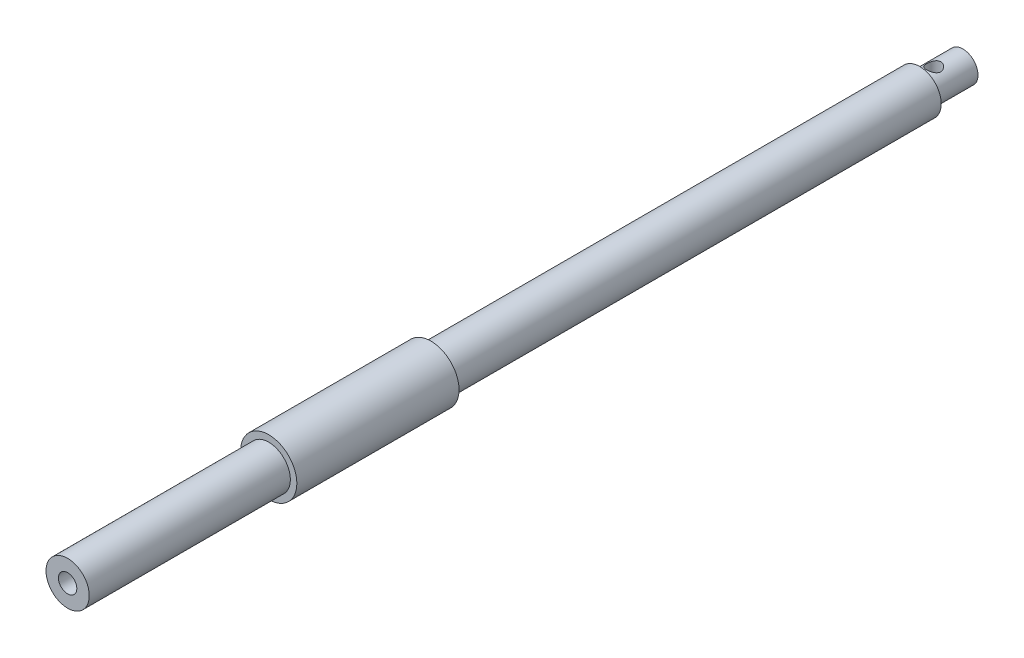
ISO-10303-21;
HEADER;
FILE_DESCRIPTION(('STEP AP214'),'2;1');
FILE_NAME('part.step','',(''),(''),'','','');
FILE_SCHEMA(('AUTOMOTIVE_DESIGN { 1 0 10303 214 1 1 1 1 }'));
ENDSEC;
DATA;
#1=APPLICATION_CONTEXT('core data for automotive mechanical design processes');
#2=APPLICATION_PROTOCOL_DEFINITION('international standard','automotive_design',2000,#1);
#3=PRODUCT_CONTEXT('',#1,'mechanical');
#4=PRODUCT('Part','Part','',(#3));
#5=PRODUCT_RELATED_PRODUCT_CATEGORY('part','',(#4));
#6=PRODUCT_DEFINITION_FORMATION('','',#4);
#7=PRODUCT_DEFINITION_CONTEXT('part definition',#1,'design');
#8=PRODUCT_DEFINITION('design','',#6,#7);
#9=PRODUCT_DEFINITION_SHAPE('','',#8);
#10=(LENGTH_UNIT() NAMED_UNIT(*) SI_UNIT(.MILLI.,.METRE.));
#11=(NAMED_UNIT(*) PLANE_ANGLE_UNIT() SI_UNIT($,.RADIAN.));
#12=(NAMED_UNIT(*) SI_UNIT($,.STERADIAN.) SOLID_ANGLE_UNIT());
#13=UNCERTAINTY_MEASURE_WITH_UNIT(LENGTH_MEASURE(1.E-05),#10,'distance_accuracy_value','');
#14=(GEOMETRIC_REPRESENTATION_CONTEXT(3) GLOBAL_UNCERTAINTY_ASSIGNED_CONTEXT((#13)) GLOBAL_UNIT_ASSIGNED_CONTEXT((#10,
#11,#12)) REPRESENTATION_CONTEXT('',''));
#15=CARTESIAN_POINT('',(0.,0.,0.));
#16=DIRECTION('',(0.,0.,1.));
#17=DIRECTION('',(1.,0.,0.));
#18=AXIS2_PLACEMENT_3D('',#15,#16,#17);
#19=CARTESIAN_POINT('',(0.,0.,20.));
#20=DIRECTION('',(0.,0.,-1.));
#21=DIRECTION('',(-1.,0.,0.));
#22=AXIS2_PLACEMENT_3D('',#19,#20,#21);
#23=CYLINDRICAL_SURFACE('',#22,7.);
#24=CARTESIAN_POINT('',(0.,0.,20.));
#25=DIRECTION('',(0.,0.,1.));
#26=DIRECTION('',(1.,0.,0.));
#27=AXIS2_PLACEMENT_3D('',#24,#25,#26);
#28=CIRCLE('',#27,7.);
#29=CARTESIAN_POINT('',(7.,0.,20.));
#30=VERTEX_POINT('',#29);
#31=EDGE_CURVE('E13',#30,#30,#28,.T.);
#32=ORIENTED_EDGE('',*,*,#31,.F.);
#33=EDGE_LOOP('',(#32));
#34=FACE_BOUND('',#33,.T.);
#35=CARTESIAN_POINT('',(0.,0.,0.));
#36=DIRECTION('',(0.,0.,1.));
#37=DIRECTION('',(1.,0.,0.));
#38=AXIS2_PLACEMENT_3D('',#35,#36,#37);
#39=CIRCLE('',#38,7.);
#40=CARTESIAN_POINT('',(7.,0.,0.));
#41=VERTEX_POINT('',#40);
#42=EDGE_CURVE('E73',#41,#41,#39,.T.);
#43=ORIENTED_EDGE('',*,*,#42,.T.);
#44=EDGE_LOOP('',(#43));
#45=FACE_BOUND('',#44,.T.);
#46=CARTESIAN_POINT('',(0.,-7.,10.25));
#47=CARTESIAN_POINT('',(0.0861856963908761,-6.99999913006246,10.2500011245142));
#48=CARTESIAN_POINT('',(0.172391418701651,-6.99840259768201,10.2534350214332));
#49=CARTESIAN_POINT('',(0.344155703874993,-6.99206483902618,10.2671221716036));
#50=CARTESIAN_POINT('',(0.429713903338527,-6.98732196273839,10.2773790029606));
#51=CARTESIAN_POINT('',(0.684731071048861,-6.96850705576051,10.3182968315066));
#52=CARTESIAN_POINT('',(0.852354462635232,-6.949849085893,10.3591048973368));
#53=CARTESIAN_POINT('',(1.17699843425214,-6.9022888874285,10.4658058978972));
#54=CARTESIAN_POINT('',(1.33405563671226,-6.87342447091548,10.531606308686));
#55=CARTESIAN_POINT('',(1.63474648490266,-6.80817682296697,10.6859881397289));
#56=CARTESIAN_POINT('',(1.77838246178129,-6.77179490079436,10.7745655937461));
#57=CARTESIAN_POINT('',(2.0568928450922,-6.69262946616689,10.9775065695655));
#58=CARTESIAN_POINT('',(2.1908681460804,-6.64960563489607,11.0930090008635));
#59=CARTESIAN_POINT('',(2.43834503289838,-6.56290303614688,11.3440549479489));
#60=CARTESIAN_POINT('',(2.55183328177385,-6.51922386193732,11.4796114150864));
#61=CARTESIAN_POINT('',(2.76244761443808,-6.43293703458588,11.7775904582445));
#62=CARTESIAN_POINT('',(2.85804962354421,-6.39057947032101,11.9411809113943));
#63=CARTESIAN_POINT('',(2.97945647393375,-6.33441607101039,12.1983238207527));
#64=CARTESIAN_POINT('',(3.01626861940464,-6.31691882714229,12.2860311208759));
#65=CARTESIAN_POINT('',(3.0821996296049,-6.28501296988896,12.4648168090702));
#66=CARTESIAN_POINT('',(3.11132276348096,-6.27060264340591,12.5558932943148));
#67=CARTESIAN_POINT('',(3.16013471397663,-6.24613907975203,12.7356429412318));
#68=CARTESIAN_POINT('',(3.18025438632322,-6.23588976465239,12.8241726989511));
#69=CARTESIAN_POINT('',(3.21304328120348,-6.21905884779143,13.0029057615992));
#70=CARTESIAN_POINT('',(3.22571621043937,-6.2124754213774,13.0931082108214));
#71=CARTESIAN_POINT('',(3.24344056616564,-6.20324085261713,13.2744278730185));
#72=CARTESIAN_POINT('',(3.24849524667927,-6.20058803137871,13.3655446786883));
#73=CARTESIAN_POINT('',(3.25092816661809,-6.19931097225763,13.5478799630924));
#74=CARTESIAN_POINT('',(3.2483069741168,-6.20068643625094,13.6390984338032));
#75=CARTESIAN_POINT('',(3.23023537804053,-6.21013911943099,13.8935633316105));
#76=CARTESIAN_POINT('',(3.2062083407774,-6.22269266506459,14.0561306900975));
#77=CARTESIAN_POINT('',(3.13440110634058,-6.2591610358673,14.3744887123914));
#78=CARTESIAN_POINT('',(3.08661489368922,-6.28307873820753,14.5302776491318));
#79=CARTESIAN_POINT('',(2.96772025611693,-6.34011527826854,14.8351059392917));
#80=CARTESIAN_POINT('',(2.8961004781902,-6.37343317440139,14.9839074943189));
#81=CARTESIAN_POINT('',(2.73194278266083,-6.4455031715495,15.2680348611697));
#82=CARTESIAN_POINT('',(2.63939575408318,-6.48425763665393,15.40335476649));
#83=CARTESIAN_POINT('',(2.42439272488121,-6.56787549574391,15.6719796975151));
#84=CARTESIAN_POINT('',(2.29979258534675,-6.61294809248038,15.8035092289553));
#85=CARTESIAN_POINT('',(2.02998577820527,-6.70069225592294,16.0444820385043));
#86=CARTESIAN_POINT('',(1.88477174910972,-6.74336295724555,16.1539173925303));
#87=CARTESIAN_POINT('',(1.57134193363961,-6.8233354701983,16.3511090968648));
#88=CARTESIAN_POINT('',(1.40249994500231,-6.86039773103516,16.437974842921));
#89=CARTESIAN_POINT('',(1.05043674581832,-6.92303804244927,16.581418953379));
#90=CARTESIAN_POINT('',(0.867225528202251,-6.94862399235188,16.6380181558923));
#91=CARTESIAN_POINT('',(0.506307506315073,-6.9838417580902,16.715218057798));
#92=CARTESIAN_POINT('',(0.329210913067729,-6.99452205167419,16.7381908267144));
#93=CARTESIAN_POINT('',(-0.0266202705065465,-7.00220752838156,16.7547621938198));
#94=CARTESIAN_POINT('',(-0.205354207977431,-6.99921794384565,16.7483720310847));
#95=CARTESIAN_POINT('',(-0.547150404219399,-6.98054813741568,16.7079322071247));
#96=CARTESIAN_POINT('',(-0.710478758260401,-6.96570092801084,16.6756975878683));
#97=CARTESIAN_POINT('',(-1.02914713220318,-6.92579653507618,16.587185275798));
#98=CARTESIAN_POINT('',(-1.18448621068133,-6.90073815139346,16.5309047567529));
#99=CARTESIAN_POINT('',(-1.48822015110681,-6.84177485790049,16.3941831645112));
#100=CARTESIAN_POINT('',(-1.63625485581478,-6.80762172693623,16.3130526975882));
#101=CARTESIAN_POINT('',(-1.91713534908754,-6.73392242732704,16.1296872444103));
#102=CARTESIAN_POINT('',(-2.04997442237811,-6.69437389113522,16.0274429830798));
#103=CARTESIAN_POINT('',(-2.30891012896,-6.60977036613832,15.7944172280544));
#104=CARTESIAN_POINT('',(-2.43341327909705,-6.56453572484847,15.6619263668846));
#105=CARTESIAN_POINT('',(-2.65902019159021,-6.4764428206208,15.3775193080519));
#106=CARTESIAN_POINT('',(-2.76011310981348,-6.43358566594895,15.2255941583827));
#107=CARTESIAN_POINT('',(-2.93886459257494,-6.35397329505537,14.9003751997244));
#108=CARTESIAN_POINT('',(-3.01568755228916,-6.31745196246493,14.7265601702027));
#109=CARTESIAN_POINT('',(-3.13819963753806,-6.25751015574103,14.3662065731531));
#110=CARTESIAN_POINT('',(-3.18392278476634,-6.23407537059824,14.1796821557272));
#111=CARTESIAN_POINT('',(-3.23920474553833,-6.20551630670493,13.8171761090029));
#112=CARTESIAN_POINT('',(-3.25163716417708,-6.19893936642936,13.6417475830149));
#113=CARTESIAN_POINT('',(-3.24801791649853,-6.20083820522232,13.2912908949258));
#114=CARTESIAN_POINT('',(-3.23197401367782,-6.20930988158857,13.1162626367254));
#115=CARTESIAN_POINT('',(-3.17443948142412,-6.23889803868127,12.7846401086296));
#116=CARTESIAN_POINT('',(-3.13484904168296,-6.25906774176591,12.6276222948128));
#117=CARTESIAN_POINT('',(-3.03346557194015,-6.30882368123357,12.3225253112951));
#118=CARTESIAN_POINT('',(-2.9716659532672,-6.33841271169734,12.1744488094052));
#119=CARTESIAN_POINT('',(-2.82297889484252,-6.40608082132019,11.8806907000352));
#120=CARTESIAN_POINT('',(-2.73470386642308,-6.44459162233717,11.7358134627078));
#121=CARTESIAN_POINT('',(-2.53726786687814,-6.52484606904618,11.4620405564908));
#122=CARTESIAN_POINT('',(-2.42809724544995,-6.56659120314142,11.333152317377));
#123=CARTESIAN_POINT('',(-2.17927051260506,-6.65355688922769,11.0818240669346));
#124=CARTESIAN_POINT('',(-2.03766698810653,-6.69871272434485,10.9612832549539));
#125=CARTESIAN_POINT('',(-1.73464778273107,-6.78348447111363,10.7453585286674));
#126=CARTESIAN_POINT('',(-1.57322278631313,-6.82309775906699,10.6499865098144));
#127=CARTESIAN_POINT('',(-1.31995138508749,-6.87496622745453,10.5286425369424));
#128=CARTESIAN_POINT('',(-1.23389302872136,-6.89096753480112,10.491876361338));
#129=CARTESIAN_POINT('',(-1.05850829561943,-6.92007501055815,10.4257806539752));
#130=CARTESIAN_POINT('',(-0.969183530687711,-6.93318258499267,10.3964475095829));
#131=CARTESIAN_POINT('',(-0.788152194058379,-6.95608561627893,10.3456158356057));
#132=CARTESIAN_POINT('',(-0.696451696342609,-6.965888765003,10.3240991021722));
#133=CARTESIAN_POINT('',(-0.511269087609372,-6.98192147613309,10.2890855317888));
#134=CARTESIAN_POINT('',(-0.41778820568039,-6.98815341767733,10.2755833553256));
#135=CARTESIAN_POINT('',(-0.2700750880978,-6.99499550057115,10.2607899065486));
#136=CARTESIAN_POINT('',(-0.216160492726661,-6.99687012279065,10.2567458809472));
#137=CARTESIAN_POINT('',(-0.108166562650541,-6.99937265737051,10.2513505491305));
#138=CARTESIAN_POINT('',(-0.0540872248220103,-7.00000054594335,10.2499992942929));
#139=CARTESIAN_POINT('',(0.,-7.,10.25));
#140=B_SPLINE_CURVE_WITH_KNOTS('',3,(#46,#47,#48,#49,#50,#51,#52,#53,#54,#55,#56,#57,#58,#59,
#60,#61,#62,#63,#64,#65,#66,#67,#68,#69,#70,#71,#72,#73,#74,#75,#76,#77,#78,#79,#80,#81,#82,#83,
#84,#85,#86,#87,#88,#89,#90,#91,#92,#93,#94,#95,#96,#97,#98,#99,#100,#101,#102,#103,#104,#105,
#106,#107,#108,#109,#110,#111,#112,#113,#114,#115,#116,#117,#118,#119,#120,#121,#122,#123,#124,
#125,#126,#127,#128,#129,#130,#131,#132,#133,#134,#135,#136,#137,#138,#139),.UNSPECIFIED.,.T.,
.F.,(4,2,2,2,2,2,2,2,2,2,2,2,2,2,2,2,2,2,2,2,2,2,2,2,2,2,2,2,2,2,2,2,2,2,2,2,2,2,2,2,2,2,2,2,2,
2,4),(0.,0.258499355359931,0.517134380784227,1.03493166321568,1.55083040768866,2.06663937788665,
2.61045344917728,3.15462027361182,3.73382572601273,4.02363573287214,4.31328448938218,
4.58699950726073,4.86057816466841,5.13403993381342,5.40748146520002,5.89938587989532,
6.39141490110333,6.89476573823468,7.39833613964655,7.95596105184819,8.51378560248522,
9.09109180761806,9.66800003171593,10.2018381353714,10.7354719219909,11.2346035319441,
11.7337938234051,12.2483263411222,12.7630853704204,13.3226531180825,13.8824795536027,
14.4598862787273,15.0366603284517,15.5617481329868,16.0866928048758,16.5741279978767,
17.0617079150486,17.5814966706898,18.1015260644058,18.6729991713513,19.2447418901874,
19.5292427093132,19.8136049877625,20.0973006960012,20.3808071857779,20.5430295333061,
20.7052549759861),.UNSPECIFIED.);
#141=CARTESIAN_POINT('',(0.,-7.,10.25));
#142=VERTEX_POINT('',#141);
#143=EDGE_CURVE('E111',#142,#142,#140,.T.);
#144=ORIENTED_EDGE('',*,*,#143,.F.);
#145=EDGE_LOOP('',(#144));
#146=FACE_BOUND('',#145,.T.);
#147=CARTESIAN_POINT('',(0.,7.,10.25));
#148=CARTESIAN_POINT('',(-0.0861856963908761,6.99999913006246,10.2500011245142));
#149=CARTESIAN_POINT('',(-0.172391418701651,6.99840259768201,10.2534350214332));
#150=CARTESIAN_POINT('',(-0.344155703874993,6.99206483902618,10.2671221716036));
#151=CARTESIAN_POINT('',(-0.429713903338527,6.98732196273839,10.2773790029606));
#152=CARTESIAN_POINT('',(-0.684731071048861,6.96850705576051,10.3182968315066));
#153=CARTESIAN_POINT('',(-0.852354462635232,6.949849085893,10.3591048973368));
#154=CARTESIAN_POINT('',(-1.17699843425214,6.9022888874285,10.4658058978972));
#155=CARTESIAN_POINT('',(-1.33405563671226,6.87342447091548,10.531606308686));
#156=CARTESIAN_POINT('',(-1.63474648490266,6.80817682296697,10.6859881397289));
#157=CARTESIAN_POINT('',(-1.77838246178129,6.77179490079436,10.7745655937461));
#158=CARTESIAN_POINT('',(-2.0568928450922,6.69262946616689,10.9775065695655));
#159=CARTESIAN_POINT('',(-2.1908681460804,6.64960563489607,11.0930090008635));
#160=CARTESIAN_POINT('',(-2.43834503289838,6.56290303614688,11.3440549479489));
#161=CARTESIAN_POINT('',(-2.55183328177385,6.51922386193732,11.4796114150864));
#162=CARTESIAN_POINT('',(-2.76244761443808,6.43293703458588,11.7775904582445));
#163=CARTESIAN_POINT('',(-2.85804962354421,6.39057947032101,11.9411809113943));
#164=CARTESIAN_POINT('',(-2.97945647393375,6.33441607101039,12.1983238207527));
#165=CARTESIAN_POINT('',(-3.01626861940464,6.31691882714229,12.2860311208759));
#166=CARTESIAN_POINT('',(-3.0821996296049,6.28501296988896,12.4648168090702));
#167=CARTESIAN_POINT('',(-3.11132276348096,6.27060264340591,12.5558932943148));
#168=CARTESIAN_POINT('',(-3.16013471397663,6.24613907975203,12.7356429412318));
#169=CARTESIAN_POINT('',(-3.18025438632322,6.23588976465239,12.8241726989511));
#170=CARTESIAN_POINT('',(-3.21304328120348,6.21905884779143,13.0029057615992));
#171=CARTESIAN_POINT('',(-3.22571621043937,6.2124754213774,13.0931082108214));
#172=CARTESIAN_POINT('',(-3.24344056616564,6.20324085261713,13.2744278730185));
#173=CARTESIAN_POINT('',(-3.24849524667927,6.20058803137871,13.3655446786883));
#174=CARTESIAN_POINT('',(-3.25092816661809,6.19931097225763,13.5478799630924));
#175=CARTESIAN_POINT('',(-3.2483069741168,6.20068643625094,13.6390984338032));
#176=CARTESIAN_POINT('',(-3.23023537804053,6.21013911943099,13.8935633316105));
#177=CARTESIAN_POINT('',(-3.2062083407774,6.22269266506459,14.0561306900975));
#178=CARTESIAN_POINT('',(-3.13440110634058,6.2591610358673,14.3744887123914));
#179=CARTESIAN_POINT('',(-3.08661489368922,6.28307873820753,14.5302776491318));
#180=CARTESIAN_POINT('',(-2.96772025611693,6.34011527826854,14.8351059392917));
#181=CARTESIAN_POINT('',(-2.8961004781902,6.37343317440139,14.9839074943189));
#182=CARTESIAN_POINT('',(-2.73194278266083,6.4455031715495,15.2680348611697));
#183=CARTESIAN_POINT('',(-2.63939575408318,6.48425763665393,15.40335476649));
#184=CARTESIAN_POINT('',(-2.42439272488121,6.56787549574391,15.6719796975151));
#185=CARTESIAN_POINT('',(-2.29979258534675,6.61294809248038,15.8035092289553));
#186=CARTESIAN_POINT('',(-2.02998577820527,6.70069225592294,16.0444820385043));
#187=CARTESIAN_POINT('',(-1.88477174910972,6.74336295724555,16.1539173925303));
#188=CARTESIAN_POINT('',(-1.57134193363961,6.8233354701983,16.3511090968648));
#189=CARTESIAN_POINT('',(-1.40249994500231,6.86039773103516,16.437974842921));
#190=CARTESIAN_POINT('',(-1.05043674581832,6.92303804244927,16.581418953379));
#191=CARTESIAN_POINT('',(-0.867225528202251,6.94862399235188,16.6380181558923));
#192=CARTESIAN_POINT('',(-0.506307506315073,6.9838417580902,16.715218057798));
#193=CARTESIAN_POINT('',(-0.329210913067729,6.99452205167419,16.7381908267144));
#194=CARTESIAN_POINT('',(0.0266202705065465,7.00220752838156,16.7547621938198));
#195=CARTESIAN_POINT('',(0.205354207977431,6.99921794384565,16.7483720310847));
#196=CARTESIAN_POINT('',(0.547150404219399,6.98054813741568,16.7079322071247));
#197=CARTESIAN_POINT('',(0.710478758260401,6.96570092801084,16.6756975878683));
#198=CARTESIAN_POINT('',(1.02914713220318,6.92579653507618,16.587185275798));
#199=CARTESIAN_POINT('',(1.18448621068133,6.90073815139346,16.5309047567529));
#200=CARTESIAN_POINT('',(1.48822015110681,6.84177485790049,16.3941831645112));
#201=CARTESIAN_POINT('',(1.63625485581478,6.80762172693623,16.3130526975882));
#202=CARTESIAN_POINT('',(1.91713534908754,6.73392242732704,16.1296872444103));
#203=CARTESIAN_POINT('',(2.04997442237811,6.69437389113522,16.0274429830798));
#204=CARTESIAN_POINT('',(2.30891012896,6.60977036613832,15.7944172280544));
#205=CARTESIAN_POINT('',(2.43341327909705,6.56453572484847,15.6619263668846));
#206=CARTESIAN_POINT('',(2.65902019159021,6.4764428206208,15.3775193080519));
#207=CARTESIAN_POINT('',(2.76011310981348,6.43358566594895,15.2255941583827));
#208=CARTESIAN_POINT('',(2.93886459257494,6.35397329505537,14.9003751997244));
#209=CARTESIAN_POINT('',(3.01568755228916,6.31745196246493,14.7265601702027));
#210=CARTESIAN_POINT('',(3.13819963753806,6.25751015574103,14.3662065731531));
#211=CARTESIAN_POINT('',(3.18392278476634,6.23407537059824,14.1796821557272));
#212=CARTESIAN_POINT('',(3.23920474553833,6.20551630670493,13.8171761090029));
#213=CARTESIAN_POINT('',(3.25163716417708,6.19893936642936,13.6417475830149));
#214=CARTESIAN_POINT('',(3.24801791649853,6.20083820522232,13.2912908949258));
#215=CARTESIAN_POINT('',(3.23197401367782,6.20930988158857,13.1162626367254));
#216=CARTESIAN_POINT('',(3.17443948142412,6.23889803868127,12.7846401086296));
#217=CARTESIAN_POINT('',(3.13484904168296,6.25906774176591,12.6276222948128));
#218=CARTESIAN_POINT('',(3.03346557194015,6.30882368123357,12.3225253112951));
#219=CARTESIAN_POINT('',(2.9716659532672,6.33841271169734,12.1744488094052));
#220=CARTESIAN_POINT('',(2.82297889484252,6.40608082132019,11.8806907000352));
#221=CARTESIAN_POINT('',(2.73470386642308,6.44459162233717,11.7358134627078));
#222=CARTESIAN_POINT('',(2.53726786687814,6.52484606904618,11.4620405564908));
#223=CARTESIAN_POINT('',(2.42809724544995,6.56659120314142,11.333152317377));
#224=CARTESIAN_POINT('',(2.17927051260506,6.65355688922769,11.0818240669346));
#225=CARTESIAN_POINT('',(2.03766698810653,6.69871272434485,10.9612832549539));
#226=CARTESIAN_POINT('',(1.73464778273107,6.78348447111363,10.7453585286674));
#227=CARTESIAN_POINT('',(1.57322278631313,6.82309775906699,10.6499865098144));
#228=CARTESIAN_POINT('',(1.31995138508749,6.87496622745453,10.5286425369424));
#229=CARTESIAN_POINT('',(1.23389302872136,6.89096753480112,10.491876361338));
#230=CARTESIAN_POINT('',(1.05850829561943,6.92007501055815,10.4257806539752));
#231=CARTESIAN_POINT('',(0.969183530687711,6.93318258499267,10.3964475095829));
#232=CARTESIAN_POINT('',(0.788152194058379,6.95608561627893,10.3456158356057));
#233=CARTESIAN_POINT('',(0.696451696342609,6.965888765003,10.3240991021722));
#234=CARTESIAN_POINT('',(0.511269087609372,6.98192147613309,10.2890855317888));
#235=CARTESIAN_POINT('',(0.41778820568039,6.98815341767733,10.2755833553256));
#236=CARTESIAN_POINT('',(0.2700750880978,6.99499550057115,10.2607899065486));
#237=CARTESIAN_POINT('',(0.216160492726661,6.99687012279065,10.2567458809472));
#238=CARTESIAN_POINT('',(0.108166562650541,6.99937265737051,10.2513505491305));
#239=CARTESIAN_POINT('',(0.0540872248220103,7.00000054594335,10.2499992942929));
#240=CARTESIAN_POINT('',(0.,7.,10.25));
#241=B_SPLINE_CURVE_WITH_KNOTS('',3,(#147,#148,#149,#150,#151,#152,#153,#154,#155,#156,#157,
#158,#159,#160,#161,#162,#163,#164,#165,#166,#167,#168,#169,#170,#171,#172,#173,#174,#175,#176,
#177,#178,#179,#180,#181,#182,#183,#184,#185,#186,#187,#188,#189,#190,#191,#192,#193,#194,#195,
#196,#197,#198,#199,#200,#201,#202,#203,#204,#205,#206,#207,#208,#209,#210,#211,#212,#213,#214,
#215,#216,#217,#218,#219,#220,#221,#222,#223,#224,#225,#226,#227,#228,#229,#230,#231,#232,#233,
#234,#235,#236,#237,#238,#239,#240),.UNSPECIFIED.,.T.,.F.,(4,2,2,2,2,2,2,2,2,2,2,2,2,2,2,2,2,2,
2,2,2,2,2,2,2,2,2,2,2,2,2,2,2,2,2,2,2,2,2,2,2,2,2,2,2,2,4),(0.,0.258499355359931,
0.517134380784227,1.03493166321568,1.55083040768866,2.06663937788665,2.61045344917728,
3.15462027361182,3.73382572601273,4.02363573287214,4.31328448938218,4.58699950726073,
4.86057816466841,5.13403993381342,5.40748146520002,5.89938587989532,6.39141490110333,
6.89476573823468,7.39833613964655,7.95596105184819,8.51378560248522,9.09109180761806,
9.66800003171593,10.2018381353714,10.7354719219909,11.2346035319441,11.7337938234051,
12.2483263411222,12.7630853704204,13.3226531180825,13.8824795536027,14.4598862787273,
15.0366603284517,15.5617481329868,16.0866928048758,16.5741279978767,17.0617079150486,
17.5814966706898,18.1015260644058,18.6729991713513,19.2447418901874,19.5292427093132,
19.8136049877625,20.0973006960012,20.3808071857779,20.5430295333061,20.7052549759861),.UNSPECIFIED.);
#242=CARTESIAN_POINT('',(0.,7.,10.25));
#243=VERTEX_POINT('',#242);
#244=EDGE_CURVE('E65',#243,#243,#241,.T.);
#245=ORIENTED_EDGE('',*,*,#244,.F.);
#246=EDGE_LOOP('',(#245));
#247=FACE_BOUND('',#246,.T.);
#248=ADVANCED_FACE('F61',(#34,#45,#146,#247),#23,.T.);
#249=CARTESIAN_POINT('',(0.,0.,0.));
#250=DIRECTION('',(0.,0.,1.));
#251=DIRECTION('',(1.,0.,0.));
#252=AXIS2_PLACEMENT_3D('',#249,#250,#251);
#253=PLANE('',#252);
#254=ORIENTED_EDGE('',*,*,#42,.F.);
#255=EDGE_LOOP('',(#254));
#256=FACE_BOUND('',#255,.T.);
#257=ADVANCED_FACE('F149',(#256),#253,.F.);
#258=CARTESIAN_POINT('',(0.,0.,246.));
#259=DIRECTION('',(0.,0.,-1.));
#260=DIRECTION('',(-1.,0.,0.));
#261=AXIS2_PLACEMENT_3D('',#258,#259,#260);
#262=CYLINDRICAL_SURFACE('',#261,10.);
#263=CARTESIAN_POINT('',(0.,0.,246.));
#264=DIRECTION('',(0.,0.,1.));
#265=DIRECTION('',(1.,0.,0.));
#266=AXIS2_PLACEMENT_3D('',#263,#264,#265);
#267=CIRCLE('',#266,10.);
#268=CARTESIAN_POINT('',(10.,0.,246.));
#269=VERTEX_POINT('',#268);
#270=EDGE_CURVE('E105',#269,#269,#267,.T.);
#271=ORIENTED_EDGE('',*,*,#270,.F.);
#272=EDGE_LOOP('',(#271));
#273=FACE_BOUND('',#272,.T.);
#274=CARTESIAN_POINT('',(0.,0.,20.));
#275=DIRECTION('',(0.,0.,1.));
#276=DIRECTION('',(1.,0.,0.));
#277=AXIS2_PLACEMENT_3D('',#274,#275,#276);
#278=CIRCLE('',#277,10.);
#279=CARTESIAN_POINT('',(10.,0.,20.));
#280=VERTEX_POINT('',#279);
#281=EDGE_CURVE('E102',#280,#280,#278,.T.);
#282=ORIENTED_EDGE('',*,*,#281,.T.);
#283=EDGE_LOOP('',(#282));
#284=FACE_BOUND('',#283,.T.);
#285=ADVANCED_FACE('F146',(#273,#284),#262,.T.);
#286=CARTESIAN_POINT('',(0.,0.,20.));
#287=DIRECTION('',(0.,0.,1.));
#288=DIRECTION('',(1.,0.,0.));
#289=AXIS2_PLACEMENT_3D('',#286,#287,#288);
#290=PLANE('',#289);
#291=ORIENTED_EDGE('',*,*,#31,.T.);
#292=EDGE_LOOP('',(#291));
#293=FACE_BOUND('',#292,.T.);
#294=ORIENTED_EDGE('',*,*,#281,.F.);
#295=EDGE_LOOP('',(#294));
#296=FACE_BOUND('',#295,.T.);
#297=ADVANCED_FACE('F142',(#293,#296),#290,.F.);
#298=CARTESIAN_POINT('',(0.,0.,321.));
#299=DIRECTION('',(0.,0.,-1.));
#300=DIRECTION('',(-1.,0.,0.));
#301=AXIS2_PLACEMENT_3D('',#298,#299,#300);
#302=CYLINDRICAL_SURFACE('',#301,13.);
#303=CARTESIAN_POINT('',(0.,0.,321.));
#304=DIRECTION('',(0.,0.,1.));
#305=DIRECTION('',(1.,0.,0.));
#306=AXIS2_PLACEMENT_3D('',#303,#304,#305);
#307=CIRCLE('',#306,13.);
#308=CARTESIAN_POINT('',(13.,0.,321.));
#309=VERTEX_POINT('',#308);
#310=EDGE_CURVE('E99',#309,#309,#307,.T.);
#311=ORIENTED_EDGE('',*,*,#310,.F.);
#312=EDGE_LOOP('',(#311));
#313=FACE_BOUND('',#312,.T.);
#314=CARTESIAN_POINT('',(0.,0.,246.));
#315=DIRECTION('',(0.,0.,1.));
#316=DIRECTION('',(1.,0.,0.));
#317=AXIS2_PLACEMENT_3D('',#314,#315,#316);
#318=CIRCLE('',#317,13.);
#319=CARTESIAN_POINT('',(13.,0.,246.));
#320=VERTEX_POINT('',#319);
#321=EDGE_CURVE('E97',#320,#320,#318,.T.);
#322=ORIENTED_EDGE('',*,*,#321,.T.);
#323=EDGE_LOOP('',(#322));
#324=FACE_BOUND('',#323,.T.);
#325=ADVANCED_FACE('F135',(#313,#324),#302,.T.);
#326=CARTESIAN_POINT('',(0.,0.,321.));
#327=DIRECTION('',(0.,0.,1.));
#328=DIRECTION('',(1.,0.,0.));
#329=AXIS2_PLACEMENT_3D('',#326,#327,#328);
#330=PLANE('',#329);
#331=CARTESIAN_POINT('',(0.,0.,321.));
#332=DIRECTION('',(0.,0.,1.));
#333=DIRECTION('',(1.,0.,0.));
#334=AXIS2_PLACEMENT_3D('',#331,#332,#333);
#335=CIRCLE('',#334,10.);
#336=CARTESIAN_POINT('',(-10.,0.,321.));
#337=VERTEX_POINT('',#336);
#338=EDGE_CURVE('E87',#337,#337,#335,.T.);
#339=ORIENTED_EDGE('',*,*,#338,.F.);
#340=EDGE_LOOP('',(#339));
#341=FACE_BOUND('',#340,.T.);
#342=ORIENTED_EDGE('',*,*,#310,.T.);
#343=EDGE_LOOP('',(#342));
#344=FACE_BOUND('',#343,.T.);
#345=ADVANCED_FACE('F132',(#341,#344),#330,.T.);
#346=CARTESIAN_POINT('',(0.,0.,246.));
#347=DIRECTION('',(0.,0.,1.));
#348=DIRECTION('',(1.,0.,0.));
#349=AXIS2_PLACEMENT_3D('',#346,#347,#348);
#350=PLANE('',#349);
#351=ORIENTED_EDGE('',*,*,#270,.T.);
#352=EDGE_LOOP('',(#351));
#353=FACE_BOUND('',#352,.T.);
#354=ORIENTED_EDGE('',*,*,#321,.F.);
#355=EDGE_LOOP('',(#354));
#356=FACE_BOUND('',#355,.T.);
#357=ADVANCED_FACE('F130',(#353,#356),#350,.F.);
#358=CARTESIAN_POINT('',(0.,0.,414.));
#359=DIRECTION('',(0.,0.,-1.));
#360=DIRECTION('',(-1.,0.,0.));
#361=AXIS2_PLACEMENT_3D('',#358,#359,#360);
#362=CYLINDRICAL_SURFACE('',#361,10.);
#363=CARTESIAN_POINT('',(0.,0.,414.));
#364=DIRECTION('',(0.,0.,1.));
#365=DIRECTION('',(1.,0.,0.));
#366=AXIS2_PLACEMENT_3D('',#363,#364,#365);
#367=CIRCLE('',#366,10.);
#368=CARTESIAN_POINT('',(-10.,0.,414.));
#369=VERTEX_POINT('',#368);
#370=EDGE_CURVE('E91',#369,#369,#367,.T.);
#371=CARTESIAN_POINT('',(-10.,0.,414.));
#372=CARTESIAN_POINT('',(-10.,0.,413.03125));
#373=CARTESIAN_POINT('',(-10.,0.,412.0625));
#374=CARTESIAN_POINT('',(-10.,0.,410.125));
#375=CARTESIAN_POINT('',(-10.,0.,409.15625));
#376=CARTESIAN_POINT('',(-10.,0.,407.21875));
#377=CARTESIAN_POINT('',(-10.,0.,406.25));
#378=CARTESIAN_POINT('',(-10.,0.,404.3125));
#379=CARTESIAN_POINT('',(-10.,0.,403.34375));
#380=CARTESIAN_POINT('',(-10.,0.,401.40625));
#381=CARTESIAN_POINT('',(-10.,0.,400.4375));
#382=CARTESIAN_POINT('',(-10.,0.,398.5));
#383=CARTESIAN_POINT('',(-10.,0.,397.53125));
#384=CARTESIAN_POINT('',(-10.,0.,395.59375));
#385=CARTESIAN_POINT('',(-10.,0.,394.625));
#386=CARTESIAN_POINT('',(-10.,0.,392.6875));
#387=CARTESIAN_POINT('',(-10.,0.,391.71875));
#388=CARTESIAN_POINT('',(-10.,0.,389.78125));
#389=CARTESIAN_POINT('',(-10.,0.,388.8125));
#390=CARTESIAN_POINT('',(-10.,0.,386.875));
#391=CARTESIAN_POINT('',(-10.,0.,385.90625));
#392=CARTESIAN_POINT('',(-10.,0.,383.96875));
#393=CARTESIAN_POINT('',(-10.,0.,383.));
#394=CARTESIAN_POINT('',(-10.,0.,381.0625));
#395=CARTESIAN_POINT('',(-10.,0.,380.09375));
#396=CARTESIAN_POINT('',(-10.,0.,378.15625));
#397=CARTESIAN_POINT('',(-10.,0.,377.1875));
#398=CARTESIAN_POINT('',(-10.,0.,375.25));
#399=CARTESIAN_POINT('',(-10.,0.,374.28125));
#400=CARTESIAN_POINT('',(-10.,0.,372.34375));
#401=CARTESIAN_POINT('',(-10.,0.,371.375));
#402=CARTESIAN_POINT('',(-10.,0.,369.4375));
#403=CARTESIAN_POINT('',(-10.,0.,368.46875));
#404=CARTESIAN_POINT('',(-10.,0.,366.53125));
#405=CARTESIAN_POINT('',(-10.,0.,365.5625));
#406=CARTESIAN_POINT('',(-10.,0.,363.625));
#407=CARTESIAN_POINT('',(-10.,0.,362.65625));
#408=CARTESIAN_POINT('',(-10.,0.,360.71875));
#409=CARTESIAN_POINT('',(-10.,0.,359.75));
#410=CARTESIAN_POINT('',(-10.,0.,357.8125));
#411=CARTESIAN_POINT('',(-10.,0.,356.84375));
#412=CARTESIAN_POINT('',(-10.,0.,354.90625));
#413=CARTESIAN_POINT('',(-10.,0.,353.9375));
#414=CARTESIAN_POINT('',(-10.,0.,352.));
#415=CARTESIAN_POINT('',(-10.,0.,351.03125));
#416=CARTESIAN_POINT('',(-10.,0.,349.09375));
#417=CARTESIAN_POINT('',(-10.,0.,348.125));
#418=CARTESIAN_POINT('',(-10.,0.,346.1875));
#419=CARTESIAN_POINT('',(-10.,0.,345.21875));
#420=CARTESIAN_POINT('',(-10.,0.,343.28125));
#421=CARTESIAN_POINT('',(-10.,0.,342.3125));
#422=CARTESIAN_POINT('',(-10.,0.,340.375));
#423=CARTESIAN_POINT('',(-10.,0.,339.40625));
#424=CARTESIAN_POINT('',(-10.,0.,337.46875));
#425=CARTESIAN_POINT('',(-10.,0.,336.5));
#426=CARTESIAN_POINT('',(-10.,0.,334.5625));
#427=CARTESIAN_POINT('',(-10.,0.,333.59375));
#428=CARTESIAN_POINT('',(-10.,0.,331.65625));
#429=CARTESIAN_POINT('',(-10.,0.,330.6875));
#430=CARTESIAN_POINT('',(-10.,0.,328.75));
#431=CARTESIAN_POINT('',(-10.,0.,327.78125));
#432=CARTESIAN_POINT('',(-10.,0.,325.84375));
#433=CARTESIAN_POINT('',(-10.,0.,324.875));
#434=CARTESIAN_POINT('',(-10.,0.,322.9375));
#435=CARTESIAN_POINT('',(-10.,0.,321.96875));
#436=CARTESIAN_POINT('',(-10.,0.,321.));
#437=B_SPLINE_CURVE_WITH_KNOTS('',3,(#371,#372,#373,#374,#375,#376,#377,#378,#379,#380,#381,
#382,#383,#384,#385,#386,#387,#388,#389,#390,#391,#392,#393,#394,#395,#396,#397,#398,#399,#400,
#401,#402,#403,#404,#405,#406,#407,#408,#409,#410,#411,#412,#413,#414,#415,#416,#417,#418,#419,
#420,#421,#422,#423,#424,#425,#426,#427,#428,#429,#430,#431,#432,#433,#434,#435,#436),
.UNSPECIFIED.,.F.,.F.,(4,2,2,2,2,2,2,2,2,2,2,2,2,2,2,2,2,2,2,2,2,2,2,2,2,2,2,2,2,2,2,2,4),(0.,
2.90625,5.8125,8.71875,11.625,14.53125,17.4375,20.34375,23.25,26.15625,29.0625,31.96875,34.875,
37.78125,40.6875,43.59375,46.5,49.40625,52.3125,55.21875,58.125,61.03125,63.9375,66.84375,69.75,
72.65625,75.5625,78.46875,81.375,84.28125,87.1875,90.09375,93.),.UNSPECIFIED.);
#438=EDGE_CURVE('BSEAM126',#369,#337,#437,.T.);
#439=ORIENTED_EDGE('',*,*,#370,.F.);
#440=ORIENTED_EDGE('',*,*,#338,.T.);
#441=ORIENTED_EDGE('',*,*,#438,.T.);
#442=ORIENTED_EDGE('',*,*,#438,.F.);
#443=EDGE_LOOP('',(#439,#441,#440,#442));
#444=FACE_BOUND('',#443,.T.);
#445=ADVANCED_FACE('F126',(#444),#362,.T.);
#446=CARTESIAN_POINT('',(0.,0.,414.));
#447=DIRECTION('',(0.,0.,1.));
#448=DIRECTION('',(1.,0.,0.));
#449=AXIS2_PLACEMENT_3D('',#446,#447,#448);
#450=PLANE('',#449);
#451=CARTESIAN_POINT('',(0.,0.,414.));
#452=DIRECTION('',(0.,0.,1.));
#453=DIRECTION('',(1.,0.,0.));
#454=AXIS2_PLACEMENT_3D('',#451,#452,#453);
#455=CIRCLE('',#454,4.24999999999999);
#456=CARTESIAN_POINT('',(4.24999999999999,0.,414.));
#457=VERTEX_POINT('',#456);
#458=EDGE_CURVE('E88',#457,#457,#455,.T.);
#459=ORIENTED_EDGE('',*,*,#458,.F.);
#460=EDGE_LOOP('',(#459));
#461=FACE_BOUND('',#460,.T.);
#462=ORIENTED_EDGE('',*,*,#370,.T.);
#463=EDGE_LOOP('',(#462));
#464=FACE_BOUND('',#463,.T.);
#465=ADVANCED_FACE('F81',(#461,#464),#450,.T.);
#466=CARTESIAN_POINT('',(0.,0.,386.5));
#467=DIRECTION('',(0.,0.,1.));
#468=DIRECTION('',(1.,0.,0.));
#469=AXIS2_PLACEMENT_3D('',#466,#467,#468);
#470=CONICAL_SURFACE('',#469,4.24999999999999,1.02974425867664);
#471=CARTESIAN_POINT('',(0.,0.,383.946342369133));
#472=VERTEX_POINT('',#471);
#473=VERTEX_LOOP('',#472);
#474=FACE_BOUND('',#473,.T.);
#475=CARTESIAN_POINT('',(0.,0.,386.5));
#476=DIRECTION('',(0.,0.,1.));
#477=DIRECTION('',(1.,0.,0.));
#478=AXIS2_PLACEMENT_3D('',#475,#476,#477);
#479=CIRCLE('',#478,4.24999999999999);
#480=CARTESIAN_POINT('',(4.24999999999999,0.,386.5));
#481=VERTEX_POINT('',#480);
#482=EDGE_CURVE('E85',#481,#481,#479,.T.);
#483=ORIENTED_EDGE('',*,*,#482,.T.);
#484=EDGE_LOOP('',(#483));
#485=FACE_BOUND('',#484,.T.);
#486=ADVANCED_FACE('F77',(#474,#485),#470,.F.);
#487=CARTESIAN_POINT('',(0.,0.,414.));
#488=DIRECTION('',(0.,0.,1.));
#489=DIRECTION('',(1.,0.,0.));
#490=AXIS2_PLACEMENT_3D('',#487,#488,#489);
#491=CYLINDRICAL_SURFACE('',#490,4.24999999999999);
#492=ORIENTED_EDGE('',*,*,#482,.F.);
#493=EDGE_LOOP('',(#492));
#494=FACE_BOUND('',#493,.T.);
#495=ORIENTED_EDGE('',*,*,#458,.T.);
#496=EDGE_LOOP('',(#495));
#497=FACE_BOUND('',#496,.T.);
#498=ADVANCED_FACE('F80',(#494,#497),#491,.F.);
#499=CARTESIAN_POINT('',(0.,10.,13.5));
#500=DIRECTION('',(0.,-1.,0.));
#501=DIRECTION('',(0.,0.,-1.));
#502=AXIS2_PLACEMENT_3D('',#499,#500,#501);
#503=CYLINDRICAL_SURFACE('',#502,3.25);
#504=ORIENTED_EDGE('',*,*,#143,.T.);
#505=EDGE_LOOP('',(#504));
#506=FACE_BOUND('',#505,.T.);
#507=ORIENTED_EDGE('',*,*,#244,.T.);
#508=EDGE_LOOP('',(#507));
#509=FACE_BOUND('',#508,.T.);
#510=ADVANCED_FACE('F116',(#506,#509),#503,.F.);
#511=CLOSED_SHELL('',(#248,#257,#285,#297,#325,#345,#357,#445,#465,#486,#498,#510));
#512=MANIFOLD_SOLID_BREP('B2',#511);
#513=ADVANCED_BREP_SHAPE_REPRESENTATION('',(#18,#512),#14);
#514=SHAPE_DEFINITION_REPRESENTATION(#9,#513);
ENDSEC;
END-ISO-10303-21;
